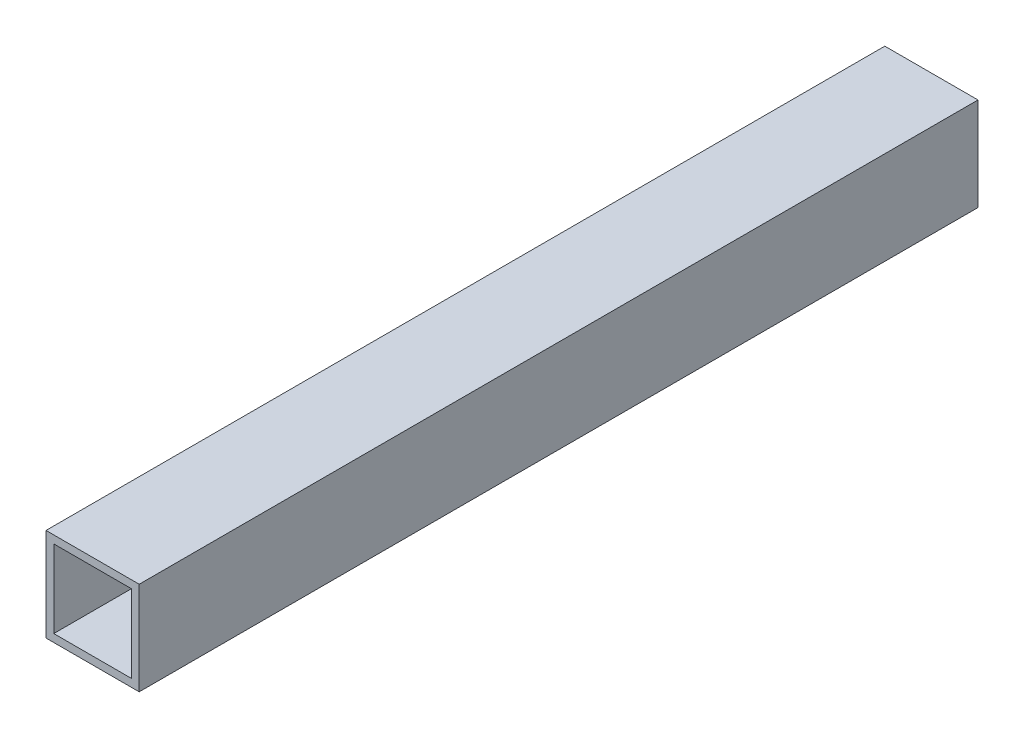
ISO-10303-21;
HEADER;
FILE_DESCRIPTION(('STEP AP214'),'2;1');
FILE_NAME('part.step','',(''),(''),'','','');
FILE_SCHEMA(('AUTOMOTIVE_DESIGN { 1 0 10303 214 1 1 1 1 }'));
ENDSEC;
DATA;
#1=APPLICATION_CONTEXT('core data for automotive mechanical design processes');
#2=APPLICATION_PROTOCOL_DEFINITION('international standard','automotive_design',2000,#1);
#3=PRODUCT_CONTEXT('',#1,'mechanical');
#4=PRODUCT('Part','Part','',(#3));
#5=PRODUCT_RELATED_PRODUCT_CATEGORY('part','',(#4));
#6=PRODUCT_DEFINITION_FORMATION('','',#4);
#7=PRODUCT_DEFINITION_CONTEXT('part definition',#1,'design');
#8=PRODUCT_DEFINITION('design','',#6,#7);
#9=PRODUCT_DEFINITION_SHAPE('','',#8);
#10=(LENGTH_UNIT() NAMED_UNIT(*) SI_UNIT(.MILLI.,.METRE.));
#11=(NAMED_UNIT(*) PLANE_ANGLE_UNIT() SI_UNIT($,.RADIAN.));
#12=(NAMED_UNIT(*) SI_UNIT($,.STERADIAN.) SOLID_ANGLE_UNIT());
#13=UNCERTAINTY_MEASURE_WITH_UNIT(LENGTH_MEASURE(1.E-05),#10,'distance_accuracy_value','');
#14=(GEOMETRIC_REPRESENTATION_CONTEXT(3) GLOBAL_UNCERTAINTY_ASSIGNED_CONTEXT((#13)) GLOBAL_UNIT_ASSIGNED_CONTEXT((#10,
#11,#12)) REPRESENTATION_CONTEXT('',''));
#15=CARTESIAN_POINT('',(0.,0.,0.));
#16=DIRECTION('',(0.,0.,1.));
#17=DIRECTION('',(1.,0.,0.));
#18=AXIS2_PLACEMENT_3D('',#15,#16,#17);
#19=CARTESIAN_POINT('',(0.,0.,216.));
#20=DIRECTION('',(0.,0.,1.));
#21=DIRECTION('',(1.,0.,0.));
#22=AXIS2_PLACEMENT_3D('',#19,#20,#21);
#23=PLANE('',#22);
#24=DIRECTION('',(0.,-1.,0.));
#25=VECTOR('',#24,1.);
#26=CARTESIAN_POINT('',(-12.,12.,216.));
#27=LINE('',#26,#25);
#28=CARTESIAN_POINT('',(-12.,12.,216.));
#29=VERTEX_POINT('',#28);
#30=CARTESIAN_POINT('',(-12.,-12.,216.));
#31=VERTEX_POINT('',#30);
#32=EDGE_CURVE('E136',#29,#31,#27,.T.);
#33=ORIENTED_EDGE('',*,*,#32,.T.);
#34=DIRECTION('',(1.,0.,0.));
#35=VECTOR('',#34,1.);
#36=CARTESIAN_POINT('',(-12.,-12.,216.));
#37=LINE('',#36,#35);
#38=CARTESIAN_POINT('',(12.,-12.,216.));
#39=VERTEX_POINT('',#38);
#40=EDGE_CURVE('E139',#31,#39,#37,.T.);
#41=ORIENTED_EDGE('',*,*,#40,.T.);
#42=DIRECTION('',(0.,1.,0.));
#43=VECTOR('',#42,1.);
#44=CARTESIAN_POINT('',(12.,12.,216.));
#45=LINE('',#44,#43);
#46=CARTESIAN_POINT('',(12.,12.,216.));
#47=VERTEX_POINT('',#46);
#48=EDGE_CURVE('E142',#39,#47,#45,.T.);
#49=ORIENTED_EDGE('',*,*,#48,.T.);
#50=DIRECTION('',(-1.,0.,0.));
#51=VECTOR('',#50,1.);
#52=CARTESIAN_POINT('',(-12.,12.,216.));
#53=LINE('',#52,#51);
#54=EDGE_CURVE('E144',#47,#29,#53,.T.);
#55=ORIENTED_EDGE('',*,*,#54,.T.);
#56=EDGE_LOOP('',(#33,#41,#49,#55));
#57=FACE_BOUND('',#56,.T.);
#58=DIRECTION('',(-1.,0.,0.));
#59=VECTOR('',#58,1.);
#60=CARTESIAN_POINT('',(-10.,10.,216.));
#61=LINE('',#60,#59);
#62=CARTESIAN_POINT('',(10.,10.,216.));
#63=VERTEX_POINT('',#62);
#64=CARTESIAN_POINT('',(-10.,10.,216.));
#65=VERTEX_POINT('',#64);
#66=EDGE_CURVE('E108',#63,#65,#61,.T.);
#67=ORIENTED_EDGE('',*,*,#66,.F.);
#68=DIRECTION('',(0.,1.,0.));
#69=VECTOR('',#68,1.);
#70=CARTESIAN_POINT('',(10.,10.,216.));
#71=LINE('',#70,#69);
#72=CARTESIAN_POINT('',(10.,-10.,216.));
#73=VERTEX_POINT('',#72);
#74=EDGE_CURVE('E100',#73,#63,#71,.T.);
#75=ORIENTED_EDGE('',*,*,#74,.F.);
#76=DIRECTION('',(1.,0.,0.));
#77=VECTOR('',#76,1.);
#78=CARTESIAN_POINT('',(-10.,-10.,216.));
#79=LINE('',#78,#77);
#80=CARTESIAN_POINT('',(-10.,-10.,216.));
#81=VERTEX_POINT('',#80);
#82=EDGE_CURVE('E122',#81,#73,#79,.T.);
#83=ORIENTED_EDGE('',*,*,#82,.F.);
#84=DIRECTION('',(0.,-1.,0.));
#85=VECTOR('',#84,1.);
#86=CARTESIAN_POINT('',(-10.,10.,216.));
#87=LINE('',#86,#85);
#88=EDGE_CURVE('E120',#65,#81,#87,.T.);
#89=ORIENTED_EDGE('',*,*,#88,.F.);
#90=EDGE_LOOP('',(#67,#75,#83,#89));
#91=FACE_BOUND('',#90,.T.);
#92=ADVANCED_FACE('F35',(#57,#91),#23,.T.);
#93=CARTESIAN_POINT('',(0.,0.,0.));
#94=DIRECTION('',(0.,0.,1.));
#95=DIRECTION('',(1.,0.,0.));
#96=AXIS2_PLACEMENT_3D('',#93,#94,#95);
#97=PLANE('',#96);
#98=DIRECTION('',(0.,-1.,0.));
#99=VECTOR('',#98,1.);
#100=CARTESIAN_POINT('',(-12.,12.,0.));
#101=LINE('',#100,#99);
#102=CARTESIAN_POINT('',(-12.,12.,0.));
#103=VERTEX_POINT('',#102);
#104=CARTESIAN_POINT('',(-12.,-12.,0.));
#105=VERTEX_POINT('',#104);
#106=EDGE_CURVE('E116',#103,#105,#101,.T.);
#107=ORIENTED_EDGE('',*,*,#106,.F.);
#108=DIRECTION('',(-1.,0.,0.));
#109=VECTOR('',#108,1.);
#110=CARTESIAN_POINT('',(-12.,12.,0.));
#111=LINE('',#110,#109);
#112=CARTESIAN_POINT('',(12.,12.,0.));
#113=VERTEX_POINT('',#112);
#114=EDGE_CURVE('E140',#113,#103,#111,.T.);
#115=ORIENTED_EDGE('',*,*,#114,.F.);
#116=DIRECTION('',(0.,1.,0.));
#117=VECTOR('',#116,1.);
#118=CARTESIAN_POINT('',(12.,12.,0.));
#119=LINE('',#118,#117);
#120=CARTESIAN_POINT('',(12.,-12.,0.));
#121=VERTEX_POINT('',#120);
#122=EDGE_CURVE('E151',#121,#113,#119,.T.);
#123=ORIENTED_EDGE('',*,*,#122,.F.);
#124=DIRECTION('',(1.,0.,0.));
#125=VECTOR('',#124,1.);
#126=CARTESIAN_POINT('',(-12.,-12.,0.));
#127=LINE('',#126,#125);
#128=EDGE_CURVE('E149',#105,#121,#127,.T.);
#129=ORIENTED_EDGE('',*,*,#128,.F.);
#130=EDGE_LOOP('',(#107,#115,#123,#129));
#131=FACE_BOUND('',#130,.T.);
#132=DIRECTION('',(0.,1.,0.));
#133=VECTOR('',#132,1.);
#134=CARTESIAN_POINT('',(10.,10.,0.));
#135=LINE('',#134,#133);
#136=CARTESIAN_POINT('',(10.,-10.,0.));
#137=VERTEX_POINT('',#136);
#138=CARTESIAN_POINT('',(10.,10.,0.));
#139=VERTEX_POINT('',#138);
#140=EDGE_CURVE('E58',#137,#139,#135,.T.);
#141=ORIENTED_EDGE('',*,*,#140,.T.);
#142=DIRECTION('',(-1.,0.,0.));
#143=VECTOR('',#142,1.);
#144=CARTESIAN_POINT('',(-10.,10.,0.));
#145=LINE('',#144,#143);
#146=CARTESIAN_POINT('',(-10.,10.,0.));
#147=VERTEX_POINT('',#146);
#148=EDGE_CURVE('E115',#139,#147,#145,.T.);
#149=ORIENTED_EDGE('',*,*,#148,.T.);
#150=DIRECTION('',(0.,-1.,0.));
#151=VECTOR('',#150,1.);
#152=CARTESIAN_POINT('',(-10.,10.,0.));
#153=LINE('',#152,#151);
#154=CARTESIAN_POINT('',(-10.,-10.,0.));
#155=VERTEX_POINT('',#154);
#156=EDGE_CURVE('E128',#147,#155,#153,.T.);
#157=ORIENTED_EDGE('',*,*,#156,.T.);
#158=DIRECTION('',(1.,0.,0.));
#159=VECTOR('',#158,1.);
#160=CARTESIAN_POINT('',(-10.,-10.,0.));
#161=LINE('',#160,#159);
#162=EDGE_CURVE('E109',#155,#137,#161,.T.);
#163=ORIENTED_EDGE('',*,*,#162,.T.);
#164=EDGE_LOOP('',(#141,#149,#157,#163));
#165=FACE_BOUND('',#164,.T.);
#166=ADVANCED_FACE('F169',(#131,#165),#97,.F.);
#167=CARTESIAN_POINT('',(-12.,12.,216.));
#168=DIRECTION('',(1.,0.,0.));
#169=DIRECTION('',(0.,1.,0.));
#170=AXIS2_PLACEMENT_3D('',#167,#168,#169);
#171=PLANE('',#170);
#172=ORIENTED_EDGE('',*,*,#106,.T.);
#173=DIRECTION('',(0.,0.,-1.));
#174=VECTOR('',#173,1.);
#175=CARTESIAN_POINT('',(-12.,-12.,216.));
#176=LINE('',#175,#174);
#177=EDGE_CURVE('E11',#31,#105,#176,.T.);
#178=ORIENTED_EDGE('',*,*,#177,.F.);
#179=ORIENTED_EDGE('',*,*,#32,.F.);
#180=DIRECTION('',(0.,0.,-1.));
#181=VECTOR('',#180,1.);
#182=CARTESIAN_POINT('',(-12.,12.,216.));
#183=LINE('',#182,#181);
#184=EDGE_CURVE('E146',#29,#103,#183,.T.);
#185=ORIENTED_EDGE('',*,*,#184,.T.);
#186=EDGE_LOOP('',(#172,#178,#179,#185));
#187=FACE_BOUND('',#186,.T.);
#188=ADVANCED_FACE('F37',(#187),#171,.F.);
#189=CARTESIAN_POINT('',(-12.,-12.,216.));
#190=DIRECTION('',(0.,1.,0.));
#191=DIRECTION('',(-1.,0.,0.));
#192=AXIS2_PLACEMENT_3D('',#189,#190,#191);
#193=PLANE('',#192);
#194=ORIENTED_EDGE('',*,*,#128,.T.);
#195=DIRECTION('',(0.,0.,-1.));
#196=VECTOR('',#195,1.);
#197=CARTESIAN_POINT('',(12.,-12.,216.));
#198=LINE('',#197,#196);
#199=EDGE_CURVE('E43',#39,#121,#198,.T.);
#200=ORIENTED_EDGE('',*,*,#199,.F.);
#201=ORIENTED_EDGE('',*,*,#40,.F.);
#202=ORIENTED_EDGE('',*,*,#177,.T.);
#203=EDGE_LOOP('',(#194,#200,#201,#202));
#204=FACE_BOUND('',#203,.T.);
#205=ADVANCED_FACE('F179',(#204),#193,.F.);
#206=CARTESIAN_POINT('',(12.,12.,216.));
#207=DIRECTION('',(-1.,0.,0.));
#208=DIRECTION('',(0.,-1.,0.));
#209=AXIS2_PLACEMENT_3D('',#206,#207,#208);
#210=PLANE('',#209);
#211=ORIENTED_EDGE('',*,*,#122,.T.);
#212=DIRECTION('',(0.,0.,-1.));
#213=VECTOR('',#212,1.);
#214=CARTESIAN_POINT('',(12.,12.,216.));
#215=LINE('',#214,#213);
#216=EDGE_CURVE('E156',#47,#113,#215,.T.);
#217=ORIENTED_EDGE('',*,*,#216,.F.);
#218=ORIENTED_EDGE('',*,*,#48,.F.);
#219=ORIENTED_EDGE('',*,*,#199,.T.);
#220=EDGE_LOOP('',(#211,#217,#218,#219));
#221=FACE_BOUND('',#220,.T.);
#222=ADVANCED_FACE('F163',(#221),#210,.F.);
#223=CARTESIAN_POINT('',(-12.,12.,216.));
#224=DIRECTION('',(0.,-1.,0.));
#225=DIRECTION('',(0.,0.,-1.));
#226=AXIS2_PLACEMENT_3D('',#223,#224,#225);
#227=PLANE('',#226);
#228=ORIENTED_EDGE('',*,*,#114,.T.);
#229=ORIENTED_EDGE('',*,*,#184,.F.);
#230=ORIENTED_EDGE('',*,*,#54,.F.);
#231=ORIENTED_EDGE('',*,*,#216,.T.);
#232=EDGE_LOOP('',(#228,#229,#230,#231));
#233=FACE_BOUND('',#232,.T.);
#234=ADVANCED_FACE('F173',(#233),#227,.F.);
#235=CARTESIAN_POINT('',(10.,10.,216.));
#236=DIRECTION('',(-1.,0.,0.));
#237=DIRECTION('',(0.,0.,1.));
#238=AXIS2_PLACEMENT_3D('',#235,#236,#237);
#239=PLANE('',#238);
#240=ORIENTED_EDGE('',*,*,#140,.F.);
#241=DIRECTION('',(0.,0.,-1.));
#242=VECTOR('',#241,1.);
#243=CARTESIAN_POINT('',(10.,-10.,216.));
#244=LINE('',#243,#242);
#245=EDGE_CURVE('E104',#73,#137,#244,.T.);
#246=ORIENTED_EDGE('',*,*,#245,.F.);
#247=ORIENTED_EDGE('',*,*,#74,.T.);
#248=DIRECTION('',(0.,0.,-1.));
#249=VECTOR('',#248,1.);
#250=CARTESIAN_POINT('',(10.,10.,216.));
#251=LINE('',#250,#249);
#252=EDGE_CURVE('E103',#63,#139,#251,.T.);
#253=ORIENTED_EDGE('',*,*,#252,.T.);
#254=EDGE_LOOP('',(#240,#246,#247,#253));
#255=FACE_BOUND('',#254,.T.);
#256=ADVANCED_FACE('F102',(#255),#239,.T.);
#257=CARTESIAN_POINT('',(-10.,10.,216.));
#258=DIRECTION('',(0.,-1.,0.));
#259=DIRECTION('',(0.,0.,-1.));
#260=AXIS2_PLACEMENT_3D('',#257,#258,#259);
#261=PLANE('',#260);
#262=ORIENTED_EDGE('',*,*,#148,.F.);
#263=ORIENTED_EDGE('',*,*,#252,.F.);
#264=ORIENTED_EDGE('',*,*,#66,.T.);
#265=DIRECTION('',(0.,0.,-1.));
#266=VECTOR('',#265,1.);
#267=CARTESIAN_POINT('',(-10.,10.,216.));
#268=LINE('',#267,#266);
#269=EDGE_CURVE('E117',#65,#147,#268,.T.);
#270=ORIENTED_EDGE('',*,*,#269,.T.);
#271=EDGE_LOOP('',(#262,#263,#264,#270));
#272=FACE_BOUND('',#271,.T.);
#273=ADVANCED_FACE('F112',(#272),#261,.T.);
#274=CARTESIAN_POINT('',(-10.,10.,216.));
#275=DIRECTION('',(1.,0.,0.));
#276=DIRECTION('',(0.,1.,0.));
#277=AXIS2_PLACEMENT_3D('',#274,#275,#276);
#278=PLANE('',#277);
#279=ORIENTED_EDGE('',*,*,#156,.F.);
#280=ORIENTED_EDGE('',*,*,#269,.F.);
#281=ORIENTED_EDGE('',*,*,#88,.T.);
#282=DIRECTION('',(0.,0.,-1.));
#283=VECTOR('',#282,1.);
#284=CARTESIAN_POINT('',(-10.,-10.,216.));
#285=LINE('',#284,#283);
#286=EDGE_CURVE('E50',#81,#155,#285,.T.);
#287=ORIENTED_EDGE('',*,*,#286,.T.);
#288=EDGE_LOOP('',(#279,#280,#281,#287));
#289=FACE_BOUND('',#288,.T.);
#290=ADVANCED_FACE('F202',(#289),#278,.T.);
#291=CARTESIAN_POINT('',(-10.,-10.,216.));
#292=DIRECTION('',(0.,1.,0.));
#293=DIRECTION('',(0.,0.,1.));
#294=AXIS2_PLACEMENT_3D('',#291,#292,#293);
#295=PLANE('',#294);
#296=ORIENTED_EDGE('',*,*,#162,.F.);
#297=ORIENTED_EDGE('',*,*,#286,.F.);
#298=ORIENTED_EDGE('',*,*,#82,.T.);
#299=ORIENTED_EDGE('',*,*,#245,.T.);
#300=EDGE_LOOP('',(#296,#297,#298,#299));
#301=FACE_BOUND('',#300,.T.);
#302=ADVANCED_FACE('F206',(#301),#295,.T.);
#303=CLOSED_SHELL('',(#92,#166,#188,#205,#222,#234,#256,#273,#290,#302));
#304=MANIFOLD_SOLID_BREP('B2',#303);
#305=ADVANCED_BREP_SHAPE_REPRESENTATION('',(#18,#304),#14);
#306=SHAPE_DEFINITION_REPRESENTATION(#9,#305);
ENDSEC;
END-ISO-10303-21;
